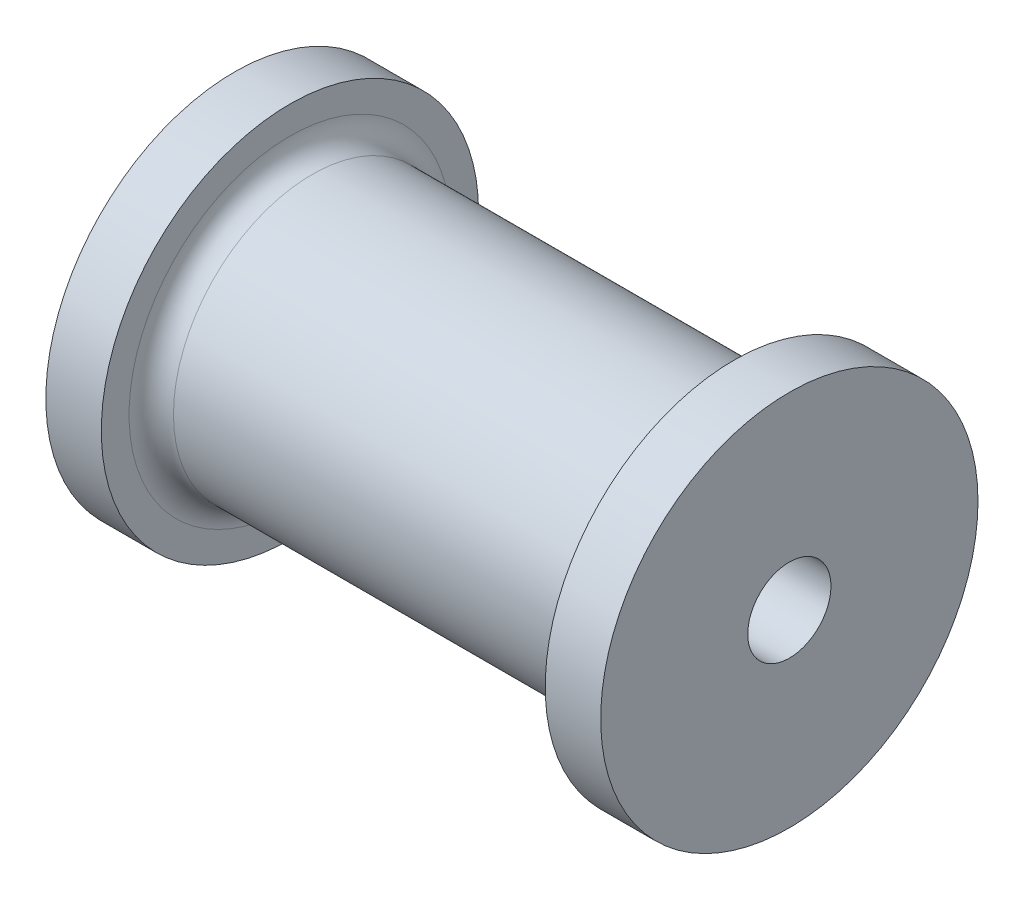
ISO-10303-21;
HEADER;
FILE_DESCRIPTION(('STEP AP214'),'2;1');
FILE_NAME('part.step','',(''),(''),'','','');
FILE_SCHEMA(('AUTOMOTIVE_DESIGN { 1 0 10303 214 1 1 1 1 }'));
ENDSEC;
DATA;
#1=APPLICATION_CONTEXT('core data for automotive mechanical design processes');
#2=APPLICATION_PROTOCOL_DEFINITION('international standard','automotive_design',2000,#1);
#3=PRODUCT_CONTEXT('',#1,'mechanical');
#4=PRODUCT('Part','Part','',(#3));
#5=PRODUCT_RELATED_PRODUCT_CATEGORY('part','',(#4));
#6=PRODUCT_DEFINITION_FORMATION('','',#4);
#7=PRODUCT_DEFINITION_CONTEXT('part definition',#1,'design');
#8=PRODUCT_DEFINITION('design','',#6,#7);
#9=PRODUCT_DEFINITION_SHAPE('','',#8);
#10=(LENGTH_UNIT() NAMED_UNIT(*) SI_UNIT(.MILLI.,.METRE.));
#11=(NAMED_UNIT(*) PLANE_ANGLE_UNIT() SI_UNIT($,.RADIAN.));
#12=(NAMED_UNIT(*) SI_UNIT($,.STERADIAN.) SOLID_ANGLE_UNIT());
#13=UNCERTAINTY_MEASURE_WITH_UNIT(LENGTH_MEASURE(1.E-05),#10,'distance_accuracy_value','');
#14=(GEOMETRIC_REPRESENTATION_CONTEXT(3) GLOBAL_UNCERTAINTY_ASSIGNED_CONTEXT((#13)) GLOBAL_UNIT_ASSIGNED_CONTEXT((#10,
#11,#12)) REPRESENTATION_CONTEXT('',''));
#15=CARTESIAN_POINT('',(0.,0.,0.));
#16=DIRECTION('',(0.,0.,1.));
#17=DIRECTION('',(1.,0.,0.));
#18=AXIS2_PLACEMENT_3D('',#15,#16,#17);
#19=CARTESIAN_POINT('',(6.35,0.,0.));
#20=DIRECTION('',(-1.,0.,0.));
#21=DIRECTION('',(0.,0.,1.));
#22=AXIS2_PLACEMENT_3D('',#19,#20,#21);
#23=CYLINDRICAL_SURFACE('',#22,21.59);
#24=CARTESIAN_POINT('',(6.35,0.,0.));
#25=DIRECTION('',(1.,0.,0.));
#26=DIRECTION('',(0.,0.,-1.));
#27=AXIS2_PLACEMENT_3D('',#24,#25,#26);
#28=CIRCLE('',#27,21.59);
#29=CARTESIAN_POINT('',(6.35,0.,-21.59));
#30=VERTEX_POINT('',#29);
#31=EDGE_CURVE('E50',#30,#30,#28,.T.);
#32=ORIENTED_EDGE('',*,*,#31,.F.);
#33=EDGE_LOOP('',(#32));
#34=FACE_BOUND('',#33,.T.);
#35=CARTESIAN_POINT('',(0.,0.,0.));
#36=DIRECTION('',(1.,0.,0.));
#37=DIRECTION('',(0.,0.,-1.));
#38=AXIS2_PLACEMENT_3D('',#35,#36,#37);
#39=CIRCLE('',#38,21.59);
#40=CARTESIAN_POINT('',(0.,0.,-21.59));
#41=VERTEX_POINT('',#40);
#42=EDGE_CURVE('E51',#41,#41,#39,.T.);
#43=ORIENTED_EDGE('',*,*,#42,.T.);
#44=EDGE_LOOP('',(#43));
#45=FACE_BOUND('',#44,.T.);
#46=ADVANCED_FACE('F30',(#34,#45),#23,.T.);
#47=CARTESIAN_POINT('',(6.35,0.,0.));
#48=DIRECTION('',(1.,0.,0.));
#49=DIRECTION('',(0.,0.,-1.));
#50=AXIS2_PLACEMENT_3D('',#47,#48,#49);
#51=PLANE('',#50);
#52=CARTESIAN_POINT('',(6.35,0.,0.));
#53=DIRECTION('',(1.,0.,0.));
#54=DIRECTION('',(0.,0.,-1.));
#55=AXIS2_PLACEMENT_3D('',#52,#53,#54);
#56=CIRCLE('',#55,18.415);
#57=CARTESIAN_POINT('',(6.35,0.,-18.415));
#58=VERTEX_POINT('',#57);
#59=EDGE_CURVE('E41',#58,#58,#56,.F.);
#60=ORIENTED_EDGE('',*,*,#59,.T.);
#61=EDGE_LOOP('',(#60));
#62=FACE_BOUND('',#61,.T.);
#63=ORIENTED_EDGE('',*,*,#31,.T.);
#64=EDGE_LOOP('',(#63));
#65=FACE_BOUND('',#64,.T.);
#66=ADVANCED_FACE('F99',(#62,#65),#51,.T.);
#67=CARTESIAN_POINT('',(0.,0.,0.));
#68=DIRECTION('',(1.,0.,0.));
#69=DIRECTION('',(0.,0.,-1.));
#70=AXIS2_PLACEMENT_3D('',#67,#68,#69);
#71=PLANE('',#70);
#72=CARTESIAN_POINT('',(0.,0.,0.));
#73=DIRECTION('',(1.,0.,0.));
#74=DIRECTION('',(0.,0.,-1.));
#75=AXIS2_PLACEMENT_3D('',#72,#73,#74);
#76=CIRCLE('',#75,4.7625);
#77=CARTESIAN_POINT('',(0.,0.,-4.7625));
#78=VERTEX_POINT('',#77);
#79=EDGE_CURVE('E60',#78,#78,#76,.T.);
#80=ORIENTED_EDGE('',*,*,#79,.T.);
#81=EDGE_LOOP('',(#80));
#82=FACE_BOUND('',#81,.T.);
#83=ORIENTED_EDGE('',*,*,#42,.F.);
#84=EDGE_LOOP('',(#83));
#85=FACE_BOUND('',#84,.T.);
#86=ADVANCED_FACE('F69',(#82,#85),#71,.F.);
#87=CARTESIAN_POINT('',(57.15,0.,0.));
#88=DIRECTION('',(-1.,0.,0.));
#89=DIRECTION('',(0.,0.,1.));
#90=AXIS2_PLACEMENT_3D('',#87,#88,#89);
#91=CYLINDRICAL_SURFACE('',#90,15.875);
#92=CARTESIAN_POINT('',(54.61,0.,0.));
#93=DIRECTION('',(1.,0.,0.));
#94=DIRECTION('',(0.,0.,-1.));
#95=AXIS2_PLACEMENT_3D('',#92,#93,#94);
#96=CIRCLE('',#95,15.875);
#97=CARTESIAN_POINT('',(54.61,0.,-15.875));
#98=VERTEX_POINT('',#97);
#99=EDGE_CURVE('E10',#98,#98,#96,.F.);
#100=ORIENTED_EDGE('',*,*,#99,.T.);
#101=EDGE_LOOP('',(#100));
#102=FACE_BOUND('',#101,.T.);
#103=CARTESIAN_POINT('',(8.89,0.,0.));
#104=DIRECTION('',(1.,0.,0.));
#105=DIRECTION('',(0.,0.,-1.));
#106=AXIS2_PLACEMENT_3D('',#103,#104,#105);
#107=CIRCLE('',#106,15.875);
#108=CARTESIAN_POINT('',(8.89,0.,-15.875));
#109=VERTEX_POINT('',#108);
#110=EDGE_CURVE('E45',#109,#109,#107,.T.);
#111=ORIENTED_EDGE('',*,*,#110,.T.);
#112=EDGE_LOOP('',(#111));
#113=FACE_BOUND('',#112,.T.);
#114=ADVANCED_FACE('F111',(#102,#113),#91,.T.);
#115=CARTESIAN_POINT('',(8.89,0.,0.));
#116=DIRECTION('',(1.,0.,0.));
#117=DIRECTION('',(0.,0.,-1.));
#118=AXIS2_PLACEMENT_3D('',#115,#116,#117);
#119=TOROIDAL_SURFACE('',#118,18.415,2.54);
#120=ORIENTED_EDGE('',*,*,#59,.F.);
#121=EDGE_LOOP('',(#120));
#122=FACE_BOUND('',#121,.T.);
#123=ORIENTED_EDGE('',*,*,#110,.F.);
#124=EDGE_LOOP('',(#123));
#125=FACE_BOUND('',#124,.T.);
#126=ADVANCED_FACE('F88',(#122,#125),#119,.F.);
#127=CARTESIAN_POINT('',(63.5,0.,0.));
#128=DIRECTION('',(-1.,0.,0.));
#129=DIRECTION('',(0.,0.,1.));
#130=AXIS2_PLACEMENT_3D('',#127,#128,#129);
#131=CYLINDRICAL_SURFACE('',#130,21.59);
#132=CARTESIAN_POINT('',(63.5,0.,0.));
#133=DIRECTION('',(1.,0.,0.));
#134=DIRECTION('',(0.,0.,-1.));
#135=AXIS2_PLACEMENT_3D('',#132,#133,#134);
#136=CIRCLE('',#135,21.59);
#137=CARTESIAN_POINT('',(63.5,0.,-21.59));
#138=VERTEX_POINT('',#137);
#139=EDGE_CURVE('E54',#138,#138,#136,.T.);
#140=ORIENTED_EDGE('',*,*,#139,.F.);
#141=EDGE_LOOP('',(#140));
#142=FACE_BOUND('',#141,.T.);
#143=CARTESIAN_POINT('',(57.15,0.,0.));
#144=DIRECTION('',(1.,0.,0.));
#145=DIRECTION('',(0.,0.,-1.));
#146=AXIS2_PLACEMENT_3D('',#143,#144,#145);
#147=CIRCLE('',#146,21.59);
#148=CARTESIAN_POINT('',(57.15,0.,-21.59));
#149=VERTEX_POINT('',#148);
#150=EDGE_CURVE('E57',#149,#149,#147,.T.);
#151=ORIENTED_EDGE('',*,*,#150,.T.);
#152=EDGE_LOOP('',(#151));
#153=FACE_BOUND('',#152,.T.);
#154=ADVANCED_FACE('F82',(#142,#153),#131,.T.);
#155=CARTESIAN_POINT('',(63.5,0.,0.));
#156=DIRECTION('',(1.,0.,0.));
#157=DIRECTION('',(0.,0.,-1.));
#158=AXIS2_PLACEMENT_3D('',#155,#156,#157);
#159=PLANE('',#158);
#160=CARTESIAN_POINT('',(63.5,0.,0.));
#161=DIRECTION('',(1.,0.,0.));
#162=DIRECTION('',(0.,0.,-1.));
#163=AXIS2_PLACEMENT_3D('',#160,#161,#162);
#164=CIRCLE('',#163,4.7625);
#165=CARTESIAN_POINT('',(63.5,0.,-4.7625));
#166=VERTEX_POINT('',#165);
#167=EDGE_CURVE('E63',#166,#166,#164,.T.);
#168=ORIENTED_EDGE('',*,*,#167,.F.);
#169=EDGE_LOOP('',(#168));
#170=FACE_BOUND('',#169,.T.);
#171=ORIENTED_EDGE('',*,*,#139,.T.);
#172=EDGE_LOOP('',(#171));
#173=FACE_BOUND('',#172,.T.);
#174=ADVANCED_FACE('F78',(#170,#173),#159,.T.);
#175=CARTESIAN_POINT('',(57.15,0.,0.));
#176=DIRECTION('',(1.,0.,0.));
#177=DIRECTION('',(0.,0.,-1.));
#178=AXIS2_PLACEMENT_3D('',#175,#176,#177);
#179=PLANE('',#178);
#180=CARTESIAN_POINT('',(57.15,0.,0.));
#181=DIRECTION('',(1.,0.,0.));
#182=DIRECTION('',(0.,0.,-1.));
#183=AXIS2_PLACEMENT_3D('',#180,#181,#182);
#184=CIRCLE('',#183,18.415);
#185=CARTESIAN_POINT('',(57.15,0.,-18.415));
#186=VERTEX_POINT('',#185);
#187=EDGE_CURVE('E37',#186,#186,#184,.T.);
#188=ORIENTED_EDGE('',*,*,#187,.T.);
#189=EDGE_LOOP('',(#188));
#190=FACE_BOUND('',#189,.T.);
#191=ORIENTED_EDGE('',*,*,#150,.F.);
#192=EDGE_LOOP('',(#191));
#193=FACE_BOUND('',#192,.T.);
#194=ADVANCED_FACE('F81',(#190,#193),#179,.F.);
#195=CARTESIAN_POINT('',(54.61,0.,0.));
#196=DIRECTION('',(1.,0.,0.));
#197=DIRECTION('',(0.,0.,-1.));
#198=AXIS2_PLACEMENT_3D('',#195,#196,#197);
#199=TOROIDAL_SURFACE('',#198,18.415,2.54);
#200=ORIENTED_EDGE('',*,*,#99,.F.);
#201=EDGE_LOOP('',(#200));
#202=FACE_BOUND('',#201,.T.);
#203=ORIENTED_EDGE('',*,*,#187,.F.);
#204=EDGE_LOOP('',(#203));
#205=FACE_BOUND('',#204,.T.);
#206=ADVANCED_FACE('F32',(#202,#205),#199,.F.);
#207=CARTESIAN_POINT('',(0.,0.,0.));
#208=DIRECTION('',(1.,0.,0.));
#209=DIRECTION('',(0.,0.,-1.));
#210=AXIS2_PLACEMENT_3D('',#207,#208,#209);
#211=CYLINDRICAL_SURFACE('',#210,4.7625);
#212=ORIENTED_EDGE('',*,*,#79,.F.);
#213=EDGE_LOOP('',(#212));
#214=FACE_BOUND('',#213,.T.);
#215=ORIENTED_EDGE('',*,*,#167,.T.);
#216=EDGE_LOOP('',(#215));
#217=FACE_BOUND('',#216,.T.);
#218=ADVANCED_FACE('F72',(#214,#217),#211,.F.);
#219=CLOSED_SHELL('',(#46,#66,#86,#114,#126,#154,#174,#194,#206,#218));
#220=MANIFOLD_SOLID_BREP('B2',#219);
#221=ADVANCED_BREP_SHAPE_REPRESENTATION('',(#18,#220),#14);
#222=SHAPE_DEFINITION_REPRESENTATION(#9,#221);
ENDSEC;
END-ISO-10303-21;
